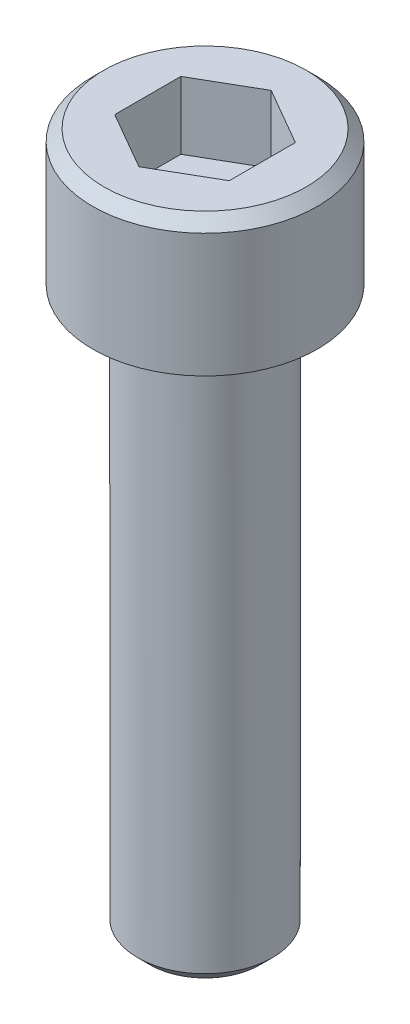
ISO-10303-21;
HEADER;
FILE_DESCRIPTION(('STEP AP214'),'2;1');
FILE_NAME('part.step','',(''),(''),'','','');
FILE_SCHEMA(('AUTOMOTIVE_DESIGN { 1 0 10303 214 1 1 1 1 }'));
ENDSEC;
DATA;
#1=APPLICATION_CONTEXT('core data for automotive mechanical design processes');
#2=APPLICATION_PROTOCOL_DEFINITION('international standard','automotive_design',2000,#1);
#3=PRODUCT_CONTEXT('',#1,'mechanical');
#4=PRODUCT('Part','Part','',(#3));
#5=PRODUCT_RELATED_PRODUCT_CATEGORY('part','',(#4));
#6=PRODUCT_DEFINITION_FORMATION('','',#4);
#7=PRODUCT_DEFINITION_CONTEXT('part definition',#1,'design');
#8=PRODUCT_DEFINITION('design','',#6,#7);
#9=PRODUCT_DEFINITION_SHAPE('','',#8);
#10=(LENGTH_UNIT() NAMED_UNIT(*) SI_UNIT(.MILLI.,.METRE.));
#11=(NAMED_UNIT(*) PLANE_ANGLE_UNIT() SI_UNIT($,.RADIAN.));
#12=(NAMED_UNIT(*) SI_UNIT($,.STERADIAN.) SOLID_ANGLE_UNIT());
#13=UNCERTAINTY_MEASURE_WITH_UNIT(LENGTH_MEASURE(1.E-05),#10,'distance_accuracy_value','');
#14=(GEOMETRIC_REPRESENTATION_CONTEXT(3) GLOBAL_UNCERTAINTY_ASSIGNED_CONTEXT((#13)) GLOBAL_UNIT_ASSIGNED_CONTEXT((#10,
#11,#12)) REPRESENTATION_CONTEXT('',''));
#15=CARTESIAN_POINT('',(0.,0.,0.));
#16=DIRECTION('',(0.,0.,1.));
#17=DIRECTION('',(1.,0.,0.));
#18=AXIS2_PLACEMENT_3D('',#15,#16,#17);
#19=CARTESIAN_POINT('',(-2.54750000003503,3.,4.41239943227305));
#20=DIRECTION('',(0.,1.,0.));
#21=DIRECTION('',(0.,0.,1.));
#22=AXIS2_PLACEMENT_3D('',#19,#20,#21);
#23=PLANE('',#22);
#24=DIRECTION('',(-0.866025403784439,0.,-0.5));
#25=VECTOR('',#24,1.);
#26=CARTESIAN_POINT('',(2.54749999998499,3.,-1.47079981079235));
#27=LINE('',#26,#25);
#28=CARTESIAN_POINT('',(2.54749999998499,3.,-1.47079981079235));
#29=VERTEX_POINT('',#28);
#30=CARTESIAN_POINT('',(-2.50201381667682E-11,3.,-2.9415996215587));
#31=VERTEX_POINT('',#30);
#32=EDGE_CURVE('E68',#29,#31,#27,.T.);
#33=ORIENTED_EDGE('',*,*,#32,.T.);
#34=DIRECTION('',(-0.866025403784439,0.,0.5));
#35=VECTOR('',#34,1.);
#36=CARTESIAN_POINT('',(-2.50202604839461E-11,3.,-2.9415996215587));
#37=LINE('',#36,#35);
#38=CARTESIAN_POINT('',(-2.54750000003503,3.,-1.47079981079235));
#39=VERTEX_POINT('',#38);
#40=EDGE_CURVE('E70',#31,#39,#37,.T.);
#41=ORIENTED_EDGE('',*,*,#40,.T.);
#42=DIRECTION('',(0.,0.,1.));
#43=VECTOR('',#42,1.);
#44=CARTESIAN_POINT('',(-2.54750000003503,3.,-1.47079981079235));
#45=LINE('',#44,#43);
#46=CARTESIAN_POINT('',(-2.54750000003503,3.,1.47079981068834));
#47=VERTEX_POINT('',#46);
#48=EDGE_CURVE('E72',#39,#47,#45,.T.);
#49=ORIENTED_EDGE('',*,*,#48,.T.);
#50=DIRECTION('',(0.866025403776784,0.,0.500000000013259));
#51=VECTOR('',#50,1.);
#52=CARTESIAN_POINT('',(-2.54750000003503,3.,1.47079981068834));
#53=LINE('',#52,#51);
#54=CARTESIAN_POINT('',(-2.50199766227928E-11,3.,2.9415996215067));
#55=VERTEX_POINT('',#54);
#56=EDGE_CURVE('E126',#47,#55,#53,.T.);
#57=ORIENTED_EDGE('',*,*,#56,.T.);
#58=DIRECTION('',(0.866025403784439,0.,-0.5));
#59=VECTOR('',#58,1.);
#60=CARTESIAN_POINT('',(-2.5020127358021E-11,3.,2.9415996215067));
#61=LINE('',#60,#59);
#62=CARTESIAN_POINT('',(2.54749999998499,3.,1.47079981074035));
#63=VERTEX_POINT('',#62);
#64=EDGE_CURVE('E131',#55,#63,#61,.T.);
#65=ORIENTED_EDGE('',*,*,#64,.T.);
#66=DIRECTION('',(0.,0.,-1.));
#67=VECTOR('',#66,1.);
#68=CARTESIAN_POINT('',(2.54749999998499,3.,1.47079981074035));
#69=LINE('',#68,#67);
#70=EDGE_CURVE('E135',#63,#29,#69,.T.);
#71=ORIENTED_EDGE('',*,*,#70,.T.);
#72=EDGE_LOOP('',(#33,#41,#49,#57,#65,#71));
#73=FACE_BOUND('',#72,.T.);
#74=ADVANCED_FACE('F17',(#73),#23,.T.);
#75=CARTESIAN_POINT('',(-2.54750000003503,3.,-1.47079981079235));
#76=DIRECTION('',(-1.,0.,0.));
#77=DIRECTION('',(0.,0.,1.));
#78=AXIS2_PLACEMENT_3D('',#75,#76,#77);
#79=PLANE('',#78);
#80=DIRECTION('',(0.,1.,0.));
#81=VECTOR('',#80,1.);
#82=CARTESIAN_POINT('',(-2.54750000003503,3.,1.47079981068834));
#83=LINE('',#82,#81);
#84=CARTESIAN_POINT('',(-2.54750000003503,6.,1.47079981068834));
#85=VERTEX_POINT('',#84);
#86=EDGE_CURVE('E83',#85,#47,#83,.F.);
#87=ORIENTED_EDGE('',*,*,#86,.T.);
#88=ORIENTED_EDGE('',*,*,#48,.F.);
#89=DIRECTION('',(0.,1.,0.));
#90=VECTOR('',#89,1.);
#91=CARTESIAN_POINT('',(-2.54750000003503,3.,-1.47079981079235));
#92=LINE('',#91,#90);
#93=CARTESIAN_POINT('',(-2.54750000003503,6.,-1.47079981079235));
#94=VERTEX_POINT('',#93);
#95=EDGE_CURVE('E77',#39,#94,#92,.T.);
#96=ORIENTED_EDGE('',*,*,#95,.T.);
#97=DIRECTION('',(0.,0.,1.));
#98=VECTOR('',#97,1.);
#99=CARTESIAN_POINT('',(-2.54750000003503,6.,0.));
#100=LINE('',#99,#98);
#101=EDGE_CURVE('E123',#85,#94,#100,.F.);
#102=ORIENTED_EDGE('',*,*,#101,.F.);
#103=EDGE_LOOP('',(#87,#88,#96,#102));
#104=FACE_BOUND('',#103,.T.);
#105=ADVANCED_FACE('F80',(#104),#79,.F.);
#106=CARTESIAN_POINT('',(-2.50202604839461E-11,3.,-2.9415996215587));
#107=DIRECTION('',(-0.5,0.,-0.866025403784439));
#108=DIRECTION('',(-0.866025403784439,0.,0.5));
#109=AXIS2_PLACEMENT_3D('',#106,#107,#108);
#110=PLANE('',#109);
#111=ORIENTED_EDGE('',*,*,#95,.F.);
#112=ORIENTED_EDGE('',*,*,#40,.F.);
#113=DIRECTION('',(0.,1.,0.));
#114=VECTOR('',#113,1.);
#115=CARTESIAN_POINT('',(-2.50203503748825E-11,3.,-2.9415996215587));
#116=LINE('',#115,#114);
#117=CARTESIAN_POINT('',(-2.50202918768871E-11,6.,-2.9415996215587));
#118=VERTEX_POINT('',#117);
#119=EDGE_CURVE('E91',#31,#118,#116,.T.);
#120=ORIENTED_EDGE('',*,*,#119,.T.);
#121=DIRECTION('',(0.866025403784439,0.,-0.5));
#122=VECTOR('',#121,1.);
#123=CARTESIAN_POINT('',(-2.54750000003503,6.,-1.47079981079235));
#124=LINE('',#123,#122);
#125=EDGE_CURVE('E88',#94,#118,#124,.T.);
#126=ORIENTED_EDGE('',*,*,#125,.F.);
#127=EDGE_LOOP('',(#111,#112,#120,#126));
#128=FACE_BOUND('',#127,.T.);
#129=ADVANCED_FACE('F86',(#128),#110,.F.);
#130=CARTESIAN_POINT('',(2.54749999998499,3.,-1.47079981079235));
#131=DIRECTION('',(0.5,0.,-0.866025403784439));
#132=DIRECTION('',(-0.866025403784439,0.,-0.5));
#133=AXIS2_PLACEMENT_3D('',#130,#131,#132);
#134=PLANE('',#133);
#135=ORIENTED_EDGE('',*,*,#119,.F.);
#136=ORIENTED_EDGE('',*,*,#32,.F.);
#137=DIRECTION('',(0.,1.,0.));
#138=VECTOR('',#137,1.);
#139=CARTESIAN_POINT('',(2.54749999998499,3.,-1.47079981079235));
#140=LINE('',#139,#138);
#141=CARTESIAN_POINT('',(2.54749999998499,6.,-1.47079981079235));
#142=VERTEX_POINT('',#141);
#143=EDGE_CURVE('E133',#29,#142,#140,.T.);
#144=ORIENTED_EDGE('',*,*,#143,.T.);
#145=DIRECTION('',(0.866025403784439,0.,0.5));
#146=VECTOR('',#145,1.);
#147=CARTESIAN_POINT('',(-2.50199166940135E-11,6.,-2.9415996215587));
#148=LINE('',#147,#146);
#149=EDGE_CURVE('E119',#118,#142,#148,.T.);
#150=ORIENTED_EDGE('',*,*,#149,.F.);
#151=EDGE_LOOP('',(#135,#136,#144,#150));
#152=FACE_BOUND('',#151,.T.);
#153=ADVANCED_FACE('F138',(#152),#134,.F.);
#154=CARTESIAN_POINT('',(2.54749999998499,3.,1.47079981074035));
#155=DIRECTION('',(1.,0.,0.));
#156=DIRECTION('',(0.,0.,-1.));
#157=AXIS2_PLACEMENT_3D('',#154,#155,#156);
#158=PLANE('',#157);
#159=ORIENTED_EDGE('',*,*,#143,.F.);
#160=ORIENTED_EDGE('',*,*,#70,.F.);
#161=DIRECTION('',(0.,1.,0.));
#162=VECTOR('',#161,1.);
#163=CARTESIAN_POINT('',(2.54749999998499,3.,1.47079981074035));
#164=LINE('',#163,#162);
#165=CARTESIAN_POINT('',(2.54749999998499,6.,1.47079981074035));
#166=VERTEX_POINT('',#165);
#167=EDGE_CURVE('E129',#63,#166,#164,.T.);
#168=ORIENTED_EDGE('',*,*,#167,.T.);
#169=DIRECTION('',(0.,0.,1.));
#170=VECTOR('',#169,1.);
#171=CARTESIAN_POINT('',(2.54749999998499,6.,0.));
#172=LINE('',#171,#170);
#173=EDGE_CURVE('E116',#142,#166,#172,.T.);
#174=ORIENTED_EDGE('',*,*,#173,.F.);
#175=EDGE_LOOP('',(#159,#160,#168,#174));
#176=FACE_BOUND('',#175,.T.);
#177=ADVANCED_FACE('F149',(#176),#158,.F.);
#178=CARTESIAN_POINT('',(-2.5020127358021E-11,3.,2.9415996215067));
#179=DIRECTION('',(0.5,0.,0.866025403784439));
#180=DIRECTION('',(0.866025403784439,0.,-0.5));
#181=AXIS2_PLACEMENT_3D('',#178,#179,#180);
#182=PLANE('',#181);
#183=ORIENTED_EDGE('',*,*,#167,.F.);
#184=ORIENTED_EDGE('',*,*,#64,.F.);
#185=DIRECTION('',(0.,1.,0.));
#186=VECTOR('',#185,1.);
#187=CARTESIAN_POINT('',(-2.50199166940135E-11,3.,2.9415996215067));
#188=LINE('',#187,#186);
#189=CARTESIAN_POINT('',(-2.50199099744113E-11,6.,2.9415996215067));
#190=VERTEX_POINT('',#189);
#191=EDGE_CURVE('E35',#55,#190,#188,.T.);
#192=ORIENTED_EDGE('',*,*,#191,.T.);
#193=DIRECTION('',(-0.866025403784439,0.,0.5));
#194=VECTOR('',#193,1.);
#195=CARTESIAN_POINT('',(2.54749999998499,6.,1.47079981074035));
#196=LINE('',#195,#194);
#197=EDGE_CURVE('E113',#166,#190,#196,.T.);
#198=ORIENTED_EDGE('',*,*,#197,.F.);
#199=EDGE_LOOP('',(#183,#184,#192,#198));
#200=FACE_BOUND('',#199,.T.);
#201=ADVANCED_FACE('F147',(#200),#182,.F.);
#202=CARTESIAN_POINT('',(-2.54750000003503,3.,1.47079981068834));
#203=DIRECTION('',(-0.500000000013259,0.,0.866025403776784));
#204=DIRECTION('',(0.866025403776784,0.,0.500000000013259));
#205=AXIS2_PLACEMENT_3D('',#202,#203,#204);
#206=PLANE('',#205);
#207=ORIENTED_EDGE('',*,*,#191,.F.);
#208=ORIENTED_EDGE('',*,*,#56,.F.);
#209=ORIENTED_EDGE('',*,*,#86,.F.);
#210=DIRECTION('',(-0.866025403776784,0.,-0.500000000013259));
#211=VECTOR('',#210,1.);
#212=CARTESIAN_POINT('',(-2.50199166940135E-11,6.,2.9415996215067));
#213=LINE('',#212,#211);
#214=EDGE_CURVE('E109',#190,#85,#213,.T.);
#215=ORIENTED_EDGE('',*,*,#214,.F.);
#216=EDGE_LOOP('',(#207,#208,#209,#215));
#217=FACE_BOUND('',#216,.T.);
#218=ADVANCED_FACE('F144',(#217),#206,.F.);
#219=CARTESIAN_POINT('',(4.5,6.,0.));
#220=DIRECTION('',(0.,1.,0.));
#221=DIRECTION('',(0.,0.,1.));
#222=AXIS2_PLACEMENT_3D('',#219,#220,#221);
#223=PLANE('',#222);
#224=CARTESIAN_POINT('',(0.,6.00000000002865,0.));
#225=DIRECTION('',(0.,-1.,0.));
#226=DIRECTION('',(0.,0.,-1.));
#227=AXIS2_PLACEMENT_3D('',#224,#225,#226);
#228=CIRCLE('',#227,4.49999999995043);
#229=CARTESIAN_POINT('',(0.,6.00000000002865,-4.49999999995043));
#230=VERTEX_POINT('',#229);
#231=EDGE_CURVE('E20',#230,#230,#228,.T.);
#232=ORIENTED_EDGE('',*,*,#231,.F.);
#233=EDGE_LOOP('',(#232));
#234=FACE_BOUND('',#233,.T.);
#235=ORIENTED_EDGE('',*,*,#197,.T.);
#236=ORIENTED_EDGE('',*,*,#214,.T.);
#237=ORIENTED_EDGE('',*,*,#101,.T.);
#238=ORIENTED_EDGE('',*,*,#125,.T.);
#239=ORIENTED_EDGE('',*,*,#149,.T.);
#240=ORIENTED_EDGE('',*,*,#173,.T.);
#241=EDGE_LOOP('',(#235,#236,#237,#238,#239,#240));
#242=FACE_BOUND('',#241,.T.);
#243=ADVANCED_FACE('F142',(#234,#242),#223,.T.);
#244=CARTESIAN_POINT('',(0.,5.49999999998363,0.));
#245=DIRECTION('',(0.,-1.,0.));
#246=DIRECTION('',(0.,0.,-1.));
#247=AXIS2_PLACEMENT_3D('',#244,#245,#246);
#248=CONICAL_SURFACE('',#247,5.0000000000523,0.785398163454292);
#249=ORIENTED_EDGE('',*,*,#231,.T.);
#250=EDGE_LOOP('',(#249));
#251=FACE_BOUND('',#250,.T.);
#252=CARTESIAN_POINT('',(0.,5.5,0.));
#253=DIRECTION('',(0.,-1.,0.));
#254=DIRECTION('',(0.,0.,-1.));
#255=AXIS2_PLACEMENT_3D('',#252,#253,#254);
#256=CIRCLE('',#255,5.);
#257=CARTESIAN_POINT('',(0.,5.5,-5.));
#258=VERTEX_POINT('',#257);
#259=EDGE_CURVE('E101',#258,#258,#256,.T.);
#260=ORIENTED_EDGE('',*,*,#259,.F.);
#261=EDGE_LOOP('',(#260));
#262=FACE_BOUND('',#261,.T.);
#263=ADVANCED_FACE('F181',(#251,#262),#248,.T.);
#264=CARTESIAN_POINT('',(0.,0.,0.));
#265=DIRECTION('',(0.,-1.,0.));
#266=DIRECTION('',(0.,0.,-1.));
#267=AXIS2_PLACEMENT_3D('',#264,#265,#266);
#268=CYLINDRICAL_SURFACE('',#267,5.);
#269=ORIENTED_EDGE('',*,*,#259,.T.);
#270=EDGE_LOOP('',(#269));
#271=FACE_BOUND('',#270,.T.);
#272=CARTESIAN_POINT('',(0.,0.,0.));
#273=DIRECTION('',(0.,-1.,0.));
#274=DIRECTION('',(0.,0.,-1.));
#275=AXIS2_PLACEMENT_3D('',#272,#273,#274);
#276=CIRCLE('',#275,5.);
#277=CARTESIAN_POINT('',(0.,0.,-5.));
#278=VERTEX_POINT('',#277);
#279=EDGE_CURVE('E99',#278,#278,#276,.T.);
#280=ORIENTED_EDGE('',*,*,#279,.F.);
#281=EDGE_LOOP('',(#280));
#282=FACE_BOUND('',#281,.T.);
#283=ADVANCED_FACE('F177',(#271,#282),#268,.T.);
#284=CARTESIAN_POINT('',(0.,-25.,0.));
#285=DIRECTION('',(0.,-1.,0.));
#286=DIRECTION('',(0.,0.,-1.));
#287=AXIS2_PLACEMENT_3D('',#284,#285,#286);
#288=PLANE('',#287);
#289=CARTESIAN_POINT('',(0.,-25.0000000000341,0.));
#290=DIRECTION('',(0.,1.,0.));
#291=DIRECTION('',(0.,0.,1.));
#292=AXIS2_PLACEMENT_3D('',#289,#290,#291);
#293=CIRCLE('',#292,2.4454999999648);
#294=CARTESIAN_POINT('',(0.,-25.0000000000341,2.4454999999648));
#295=VERTEX_POINT('',#294);
#296=EDGE_CURVE('E97',#295,#295,#293,.T.);
#297=ORIENTED_EDGE('',*,*,#296,.F.);
#298=EDGE_LOOP('',(#297));
#299=FACE_BOUND('',#298,.T.);
#300=ADVANCED_FACE('F174',(#299),#288,.T.);
#301=CARTESIAN_POINT('',(0.,0.,0.));
#302=DIRECTION('',(0.,-1.,0.));
#303=DIRECTION('',(0.,0.,-1.));
#304=AXIS2_PLACEMENT_3D('',#301,#302,#303);
#305=PLANE('',#304);
#306=ORIENTED_EDGE('',*,*,#279,.T.);
#307=EDGE_LOOP('',(#306));
#308=FACE_BOUND('',#307,.T.);
#309=CARTESIAN_POINT('',(0.,0.,0.));
#310=DIRECTION('',(0.,-1.,0.));
#311=DIRECTION('',(0.,0.,-1.));
#312=AXIS2_PLACEMENT_3D('',#309,#310,#311);
#313=CIRCLE('',#312,3.);
#314=CARTESIAN_POINT('',(0.,0.,-3.));
#315=VERTEX_POINT('',#314);
#316=EDGE_CURVE('E26',#315,#315,#313,.T.);
#317=ORIENTED_EDGE('',*,*,#316,.F.);
#318=EDGE_LOOP('',(#317));
#319=FACE_BOUND('',#318,.T.);
#320=ADVANCED_FACE('F167',(#308,#319),#305,.T.);
#321=CARTESIAN_POINT('',(0.,-24.4454999999562,0.));
#322=DIRECTION('',(0.,1.,0.));
#323=DIRECTION('',(0.,0.,1.));
#324=AXIS2_PLACEMENT_3D('',#321,#322,#323);
#325=CONICAL_SURFACE('',#324,2.9999999999859,0.785398163346192);
#326=CARTESIAN_POINT('',(0.,-24.4455,0.));
#327=DIRECTION('',(0.,-1.,0.));
#328=DIRECTION('',(0.,0.,-1.));
#329=AXIS2_PLACEMENT_3D('',#326,#327,#328);
#330=CIRCLE('',#329,3.);
#331=CARTESIAN_POINT('',(0.,-24.4455,-3.));
#332=VERTEX_POINT('',#331);
#333=EDGE_CURVE('E11',#332,#332,#330,.F.);
#334=ORIENTED_EDGE('',*,*,#333,.F.);
#335=EDGE_LOOP('',(#334));
#336=FACE_BOUND('',#335,.T.);
#337=ORIENTED_EDGE('',*,*,#296,.T.);
#338=EDGE_LOOP('',(#337));
#339=FACE_BOUND('',#338,.T.);
#340=ADVANCED_FACE('F161',(#336,#339),#325,.T.);
#341=CARTESIAN_POINT('',(0.,0.,0.));
#342=DIRECTION('',(0.,-1.,0.));
#343=DIRECTION('',(0.,0.,-1.));
#344=AXIS2_PLACEMENT_3D('',#341,#342,#343);
#345=CYLINDRICAL_SURFACE('',#344,3.);
#346=ORIENTED_EDGE('',*,*,#333,.T.);
#347=EDGE_LOOP('',(#346));
#348=FACE_BOUND('',#347,.T.);
#349=ORIENTED_EDGE('',*,*,#316,.T.);
#350=EDGE_LOOP('',(#349));
#351=FACE_BOUND('',#350,.T.);
#352=ADVANCED_FACE('F159',(#348,#351),#345,.T.);
#353=CLOSED_SHELL('',(#74,#105,#129,#153,#177,#201,#218,#243,#263,#283,#300,#320,#340,#352));
#354=MANIFOLD_SOLID_BREP('B1',#353);
#355=ADVANCED_BREP_SHAPE_REPRESENTATION('',(#18,#354),#14);
#356=SHAPE_DEFINITION_REPRESENTATION(#9,#355);
ENDSEC;
END-ISO-10303-21;
